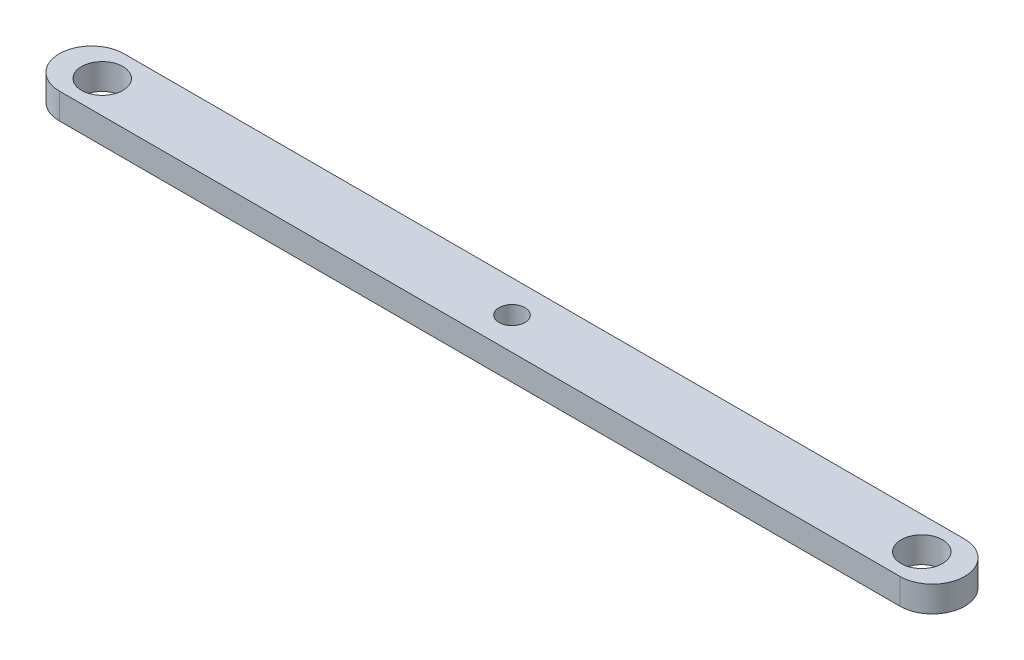
ISO-10303-21;
HEADER;
FILE_DESCRIPTION(('STEP AP214'),'2;1');
FILE_NAME('part.step','',(''),(''),'','','');
FILE_SCHEMA(('AUTOMOTIVE_DESIGN { 1 0 10303 214 1 1 1 1 }'));
ENDSEC;
DATA;
#1=APPLICATION_CONTEXT('core data for automotive mechanical design processes');
#2=APPLICATION_PROTOCOL_DEFINITION('international standard','automotive_design',2000,#1);
#3=PRODUCT_CONTEXT('',#1,'mechanical');
#4=PRODUCT('Part','Part','',(#3));
#5=PRODUCT_RELATED_PRODUCT_CATEGORY('part','',(#4));
#6=PRODUCT_DEFINITION_FORMATION('','',#4);
#7=PRODUCT_DEFINITION_CONTEXT('part definition',#1,'design');
#8=PRODUCT_DEFINITION('design','',#6,#7);
#9=PRODUCT_DEFINITION_SHAPE('','',#8);
#10=(LENGTH_UNIT() NAMED_UNIT(*) SI_UNIT(.MILLI.,.METRE.));
#11=(NAMED_UNIT(*) PLANE_ANGLE_UNIT() SI_UNIT($,.RADIAN.));
#12=(NAMED_UNIT(*) SI_UNIT($,.STERADIAN.) SOLID_ANGLE_UNIT());
#13=UNCERTAINTY_MEASURE_WITH_UNIT(LENGTH_MEASURE(1.E-05),#10,'distance_accuracy_value','');
#14=(GEOMETRIC_REPRESENTATION_CONTEXT(3) GLOBAL_UNCERTAINTY_ASSIGNED_CONTEXT((#13)) GLOBAL_UNIT_ASSIGNED_CONTEXT((#10,
#11,#12)) REPRESENTATION_CONTEXT('',''));
#15=CARTESIAN_POINT('',(0.,0.,0.));
#16=DIRECTION('',(0.,0.,1.));
#17=DIRECTION('',(1.,0.,0.));
#18=AXIS2_PLACEMENT_3D('',#15,#16,#17);
#19=CARTESIAN_POINT('',(67.5,2.,-2.5));
#20=DIRECTION('',(0.,-1.,0.));
#21=DIRECTION('',(0.,0.,-1.));
#22=AXIS2_PLACEMENT_3D('',#19,#20,#21);
#23=CYLINDRICAL_SURFACE('',#22,2.5);
#24=DIRECTION('',(0.,-1.,0.));
#25=VECTOR('',#24,1.);
#26=CARTESIAN_POINT('',(67.5,2.,-5.));
#27=LINE('',#26,#25);
#28=CARTESIAN_POINT('',(67.5,2.,-5.));
#29=VERTEX_POINT('',#28);
#30=CARTESIAN_POINT('',(67.5,0.,-5.));
#31=VERTEX_POINT('',#30);
#32=EDGE_CURVE('E91',#29,#31,#27,.T.);
#33=ORIENTED_EDGE('',*,*,#32,.F.);
#34=CARTESIAN_POINT('',(67.5,2.,-2.5));
#35=DIRECTION('',(0.,-1.,0.));
#36=DIRECTION('',(0.,0.,-1.));
#37=AXIS2_PLACEMENT_3D('',#34,#35,#36);
#38=CIRCLE('',#37,2.5);
#39=CARTESIAN_POINT('',(67.5,2.,0.));
#40=VERTEX_POINT('',#39);
#41=EDGE_CURVE('E51',#40,#29,#38,.F.);
#42=ORIENTED_EDGE('',*,*,#41,.F.);
#43=DIRECTION('',(0.,-1.,0.));
#44=VECTOR('',#43,1.);
#45=CARTESIAN_POINT('',(67.5,2.,0.));
#46=LINE('',#45,#44);
#47=CARTESIAN_POINT('',(67.5,0.,0.));
#48=VERTEX_POINT('',#47);
#49=EDGE_CURVE('E117',#48,#40,#46,.F.);
#50=ORIENTED_EDGE('',*,*,#49,.F.);
#51=CARTESIAN_POINT('',(67.5,0.,-2.5));
#52=DIRECTION('',(0.,-1.,0.));
#53=DIRECTION('',(0.,0.,-1.));
#54=AXIS2_PLACEMENT_3D('',#51,#52,#53);
#55=CIRCLE('',#54,2.5);
#56=EDGE_CURVE('E11',#31,#48,#55,.T.);
#57=ORIENTED_EDGE('',*,*,#56,.F.);
#58=EDGE_LOOP('',(#33,#42,#50,#57));
#59=FACE_BOUND('',#58,.T.);
#60=ADVANCED_FACE('F43',(#59),#23,.T.);
#61=CARTESIAN_POINT('',(2.5,2.,-2.5));
#62=DIRECTION('',(0.,-1.,0.));
#63=DIRECTION('',(0.,0.,-1.));
#64=AXIS2_PLACEMENT_3D('',#61,#62,#63);
#65=CYLINDRICAL_SURFACE('',#64,2.5);
#66=DIRECTION('',(0.,-1.,0.));
#67=VECTOR('',#66,1.);
#68=CARTESIAN_POINT('',(2.5,2.,0.));
#69=LINE('',#68,#67);
#70=CARTESIAN_POINT('',(2.5,2.,0.));
#71=VERTEX_POINT('',#70);
#72=CARTESIAN_POINT('',(2.5,0.,0.));
#73=VERTEX_POINT('',#72);
#74=EDGE_CURVE('E87',#71,#73,#69,.T.);
#75=ORIENTED_EDGE('',*,*,#74,.F.);
#76=CARTESIAN_POINT('',(2.5,2.,-2.5));
#77=DIRECTION('',(0.,-1.,0.));
#78=DIRECTION('',(0.,0.,-1.));
#79=AXIS2_PLACEMENT_3D('',#76,#77,#78);
#80=CIRCLE('',#79,2.5);
#81=CARTESIAN_POINT('',(2.5,2.,-5.));
#82=VERTEX_POINT('',#81);
#83=EDGE_CURVE('E92',#82,#71,#80,.F.);
#84=ORIENTED_EDGE('',*,*,#83,.F.);
#85=DIRECTION('',(0.,-1.,0.));
#86=VECTOR('',#85,1.);
#87=CARTESIAN_POINT('',(2.5,2.,-5.));
#88=LINE('',#87,#86);
#89=CARTESIAN_POINT('',(2.5,0.,-5.));
#90=VERTEX_POINT('',#89);
#91=EDGE_CURVE('E90',#90,#82,#88,.F.);
#92=ORIENTED_EDGE('',*,*,#91,.F.);
#93=CARTESIAN_POINT('',(2.5,0.,-2.5));
#94=DIRECTION('',(0.,-1.,0.));
#95=DIRECTION('',(0.,0.,-1.));
#96=AXIS2_PLACEMENT_3D('',#93,#94,#95);
#97=CIRCLE('',#96,2.5);
#98=EDGE_CURVE('E83',#73,#90,#97,.T.);
#99=ORIENTED_EDGE('',*,*,#98,.F.);
#100=EDGE_LOOP('',(#75,#84,#92,#99));
#101=FACE_BOUND('',#100,.T.);
#102=ADVANCED_FACE('F85',(#101),#65,.T.);
#103=CARTESIAN_POINT('',(0.,2.,0.));
#104=DIRECTION('',(0.,0.,-1.));
#105=DIRECTION('',(-1.,0.,0.));
#106=AXIS2_PLACEMENT_3D('',#103,#104,#105);
#107=PLANE('',#106);
#108=DIRECTION('',(1.,0.,0.));
#109=VECTOR('',#108,1.);
#110=CARTESIAN_POINT('',(0.,0.,0.));
#111=LINE('',#110,#109);
#112=EDGE_CURVE('E97',#73,#48,#111,.T.);
#113=ORIENTED_EDGE('',*,*,#112,.T.);
#114=ORIENTED_EDGE('',*,*,#49,.T.);
#115=DIRECTION('',(1.,0.,0.));
#116=VECTOR('',#115,1.);
#117=CARTESIAN_POINT('',(0.,2.,0.));
#118=LINE('',#117,#116);
#119=EDGE_CURVE('E99',#71,#40,#118,.T.);
#120=ORIENTED_EDGE('',*,*,#119,.F.);
#121=ORIENTED_EDGE('',*,*,#74,.T.);
#122=EDGE_LOOP('',(#113,#114,#120,#121));
#123=FACE_BOUND('',#122,.T.);
#124=ADVANCED_FACE('F96',(#123),#107,.F.);
#125=CARTESIAN_POINT('',(0.,2.,-5.));
#126=DIRECTION('',(0.,0.,1.));
#127=DIRECTION('',(1.,0.,0.));
#128=AXIS2_PLACEMENT_3D('',#125,#126,#127);
#129=PLANE('',#128);
#130=DIRECTION('',(-1.,0.,0.));
#131=VECTOR('',#130,1.);
#132=CARTESIAN_POINT('',(0.,2.,-5.));
#133=LINE('',#132,#131);
#134=EDGE_CURVE('E100',#29,#82,#133,.T.);
#135=ORIENTED_EDGE('',*,*,#134,.F.);
#136=ORIENTED_EDGE('',*,*,#32,.T.);
#137=DIRECTION('',(-1.,0.,0.));
#138=VECTOR('',#137,1.);
#139=CARTESIAN_POINT('',(0.,0.,-5.));
#140=LINE('',#139,#138);
#141=EDGE_CURVE('E103',#31,#90,#140,.T.);
#142=ORIENTED_EDGE('',*,*,#141,.T.);
#143=ORIENTED_EDGE('',*,*,#91,.T.);
#144=EDGE_LOOP('',(#135,#136,#142,#143));
#145=FACE_BOUND('',#144,.T.);
#146=ADVANCED_FACE('F122',(#145),#129,.F.);
#147=CARTESIAN_POINT('',(0.,2.,0.));
#148=DIRECTION('',(0.,-1.,0.));
#149=DIRECTION('',(0.,0.,-1.));
#150=AXIS2_PLACEMENT_3D('',#147,#148,#149);
#151=PLANE('',#150);
#152=CARTESIAN_POINT('',(35.,2.,-2.5));
#153=DIRECTION('',(0.,1.,0.));
#154=DIRECTION('',(0.,0.,1.));
#155=AXIS2_PLACEMENT_3D('',#152,#153,#154);
#156=CIRCLE('',#155,0.999999999999998);
#157=CARTESIAN_POINT('',(35.,2.,-1.50000000000001));
#158=VERTEX_POINT('',#157);
#159=EDGE_CURVE('E130',#158,#158,#156,.T.);
#160=ORIENTED_EDGE('',*,*,#159,.F.);
#161=EDGE_LOOP('',(#160));
#162=FACE_BOUND('',#161,.T.);
#163=CARTESIAN_POINT('',(66.682907,2.,-2.5));
#164=DIRECTION('',(0.,-1.,0.));
#165=DIRECTION('',(0.,0.,-1.));
#166=AXIS2_PLACEMENT_3D('',#163,#164,#165);
#167=CIRCLE('',#166,1.60000000000001);
#168=CARTESIAN_POINT('',(66.682907,2.,-4.10000000000001));
#169=VERTEX_POINT('',#168);
#170=EDGE_CURVE('E104',#169,#169,#167,.T.);
#171=ORIENTED_EDGE('',*,*,#170,.T.);
#172=EDGE_LOOP('',(#171));
#173=FACE_BOUND('',#172,.T.);
#174=CARTESIAN_POINT('',(3.31709299999999,2.,-2.5));
#175=DIRECTION('',(0.,-1.,0.));
#176=DIRECTION('',(0.,0.,-1.));
#177=AXIS2_PLACEMENT_3D('',#174,#175,#176);
#178=CIRCLE('',#177,1.6);
#179=CARTESIAN_POINT('',(3.31709299999999,2.,-4.1));
#180=VERTEX_POINT('',#179);
#181=EDGE_CURVE('E108',#180,#180,#178,.T.);
#182=ORIENTED_EDGE('',*,*,#181,.T.);
#183=EDGE_LOOP('',(#182));
#184=FACE_BOUND('',#183,.T.);
#185=ORIENTED_EDGE('',*,*,#119,.T.);
#186=ORIENTED_EDGE('',*,*,#41,.T.);
#187=ORIENTED_EDGE('',*,*,#134,.T.);
#188=ORIENTED_EDGE('',*,*,#83,.T.);
#189=EDGE_LOOP('',(#185,#186,#187,#188));
#190=FACE_BOUND('',#189,.T.);
#191=ADVANCED_FACE('F119',(#162,#173,#184,#190),#151,.F.);
#192=CARTESIAN_POINT('',(0.,0.,0.));
#193=DIRECTION('',(0.,-1.,0.));
#194=DIRECTION('',(0.,0.,-1.));
#195=AXIS2_PLACEMENT_3D('',#192,#193,#194);
#196=PLANE('',#195);
#197=CARTESIAN_POINT('',(35.,0.,-2.5));
#198=DIRECTION('',(0.,-1.,0.));
#199=DIRECTION('',(0.,0.,-1.));
#200=AXIS2_PLACEMENT_3D('',#197,#198,#199);
#201=CIRCLE('',#200,0.999999999999998);
#202=CARTESIAN_POINT('',(35.,0.,-3.5));
#203=VERTEX_POINT('',#202);
#204=EDGE_CURVE('E133',#203,#203,#201,.F.);
#205=ORIENTED_EDGE('',*,*,#204,.T.);
#206=EDGE_LOOP('',(#205));
#207=FACE_BOUND('',#206,.T.);
#208=CARTESIAN_POINT('',(66.682907,0.,-2.5));
#209=DIRECTION('',(0.,1.,0.));
#210=DIRECTION('',(0.,0.,1.));
#211=AXIS2_PLACEMENT_3D('',#208,#209,#210);
#212=CIRCLE('',#211,1.60000000000001);
#213=CARTESIAN_POINT('',(66.682907,0.,-0.899999999999995));
#214=VERTEX_POINT('',#213);
#215=EDGE_CURVE('E126',#214,#214,#212,.T.);
#216=ORIENTED_EDGE('',*,*,#215,.T.);
#217=EDGE_LOOP('',(#216));
#218=FACE_BOUND('',#217,.T.);
#219=CARTESIAN_POINT('',(3.31709299999999,0.,-2.5));
#220=DIRECTION('',(0.,1.,0.));
#221=DIRECTION('',(0.,0.,1.));
#222=AXIS2_PLACEMENT_3D('',#219,#220,#221);
#223=CIRCLE('',#222,1.6);
#224=CARTESIAN_POINT('',(3.31709299999999,0.,-0.9));
#225=VERTEX_POINT('',#224);
#226=EDGE_CURVE('E127',#225,#225,#223,.T.);
#227=ORIENTED_EDGE('',*,*,#226,.T.);
#228=EDGE_LOOP('',(#227));
#229=FACE_BOUND('',#228,.T.);
#230=ORIENTED_EDGE('',*,*,#141,.F.);
#231=ORIENTED_EDGE('',*,*,#56,.T.);
#232=ORIENTED_EDGE('',*,*,#112,.F.);
#233=ORIENTED_EDGE('',*,*,#98,.T.);
#234=EDGE_LOOP('',(#230,#231,#232,#233));
#235=FACE_BOUND('',#234,.T.);
#236=ADVANCED_FACE('F102',(#207,#218,#229,#235),#196,.T.);
#237=CARTESIAN_POINT('',(3.31709299999999,0.,-2.5));
#238=DIRECTION('',(0.,1.,0.));
#239=DIRECTION('',(0.,0.,1.));
#240=AXIS2_PLACEMENT_3D('',#237,#238,#239);
#241=CYLINDRICAL_SURFACE('',#240,1.6);
#242=ORIENTED_EDGE('',*,*,#226,.F.);
#243=EDGE_LOOP('',(#242));
#244=FACE_BOUND('',#243,.T.);
#245=ORIENTED_EDGE('',*,*,#181,.F.);
#246=EDGE_LOOP('',(#245));
#247=FACE_BOUND('',#246,.T.);
#248=ADVANCED_FACE('F148',(#244,#247),#241,.F.);
#249=CARTESIAN_POINT('',(66.682907,0.,-2.5));
#250=DIRECTION('',(0.,1.,0.));
#251=DIRECTION('',(0.,0.,1.));
#252=AXIS2_PLACEMENT_3D('',#249,#250,#251);
#253=CYLINDRICAL_SURFACE('',#252,1.60000000000001);
#254=ORIENTED_EDGE('',*,*,#215,.F.);
#255=EDGE_LOOP('',(#254));
#256=FACE_BOUND('',#255,.T.);
#257=ORIENTED_EDGE('',*,*,#170,.F.);
#258=EDGE_LOOP('',(#257));
#259=FACE_BOUND('',#258,.T.);
#260=ADVANCED_FACE('F150',(#256,#259),#253,.F.);
#261=CARTESIAN_POINT('',(35.,-0.00100000000000013,-2.5));
#262=DIRECTION('',(0.,1.,0.));
#263=DIRECTION('',(0.,0.,1.));
#264=AXIS2_PLACEMENT_3D('',#261,#262,#263);
#265=CYLINDRICAL_SURFACE('',#264,0.999999999999998);
#266=ORIENTED_EDGE('',*,*,#204,.F.);
#267=EDGE_LOOP('',(#266));
#268=FACE_BOUND('',#267,.T.);
#269=ORIENTED_EDGE('',*,*,#159,.T.);
#270=EDGE_LOOP('',(#269));
#271=FACE_BOUND('',#270,.T.);
#272=ADVANCED_FACE('F139',(#268,#271),#265,.F.);
#273=CLOSED_SHELL('',(#60,#102,#124,#146,#191,#236,#248,#260,#272));
#274=MANIFOLD_SOLID_BREP('B2',#273);
#275=ADVANCED_BREP_SHAPE_REPRESENTATION('',(#18,#274),#14);
#276=SHAPE_DEFINITION_REPRESENTATION(#9,#275);
ENDSEC;
END-ISO-10303-21;
